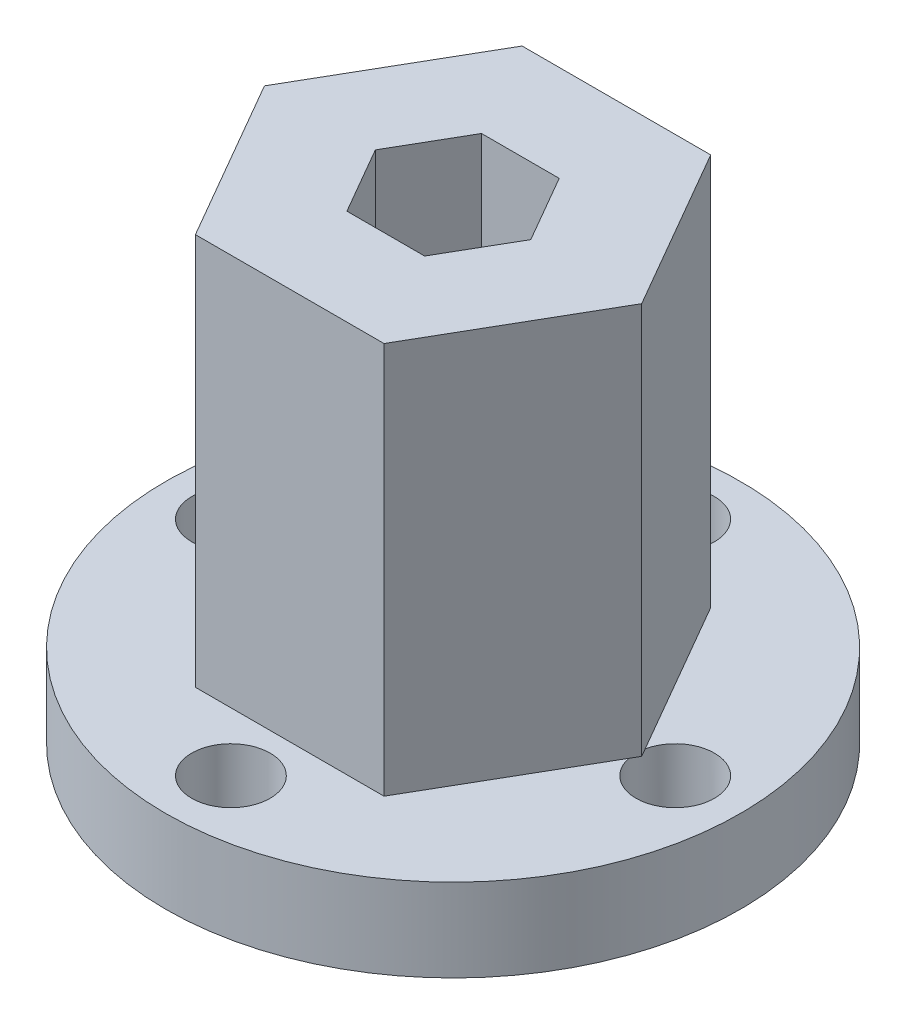
ISO-10303-21;
HEADER;
FILE_DESCRIPTION(('STEP AP214'),'2;1');
FILE_NAME('part.step','',(''),(''),'','','');
FILE_SCHEMA(('AUTOMOTIVE_DESIGN { 1 0 10303 214 1 1 1 1 }'));
ENDSEC;
DATA;
#1=APPLICATION_CONTEXT('core data for automotive mechanical design processes');
#2=APPLICATION_PROTOCOL_DEFINITION('international standard','automotive_design',2000,#1);
#3=PRODUCT_CONTEXT('',#1,'mechanical');
#4=PRODUCT('Part','Part','',(#3));
#5=PRODUCT_RELATED_PRODUCT_CATEGORY('part','',(#4));
#6=PRODUCT_DEFINITION_FORMATION('','',#4);
#7=PRODUCT_DEFINITION_CONTEXT('part definition',#1,'design');
#8=PRODUCT_DEFINITION('design','',#6,#7);
#9=PRODUCT_DEFINITION_SHAPE('','',#8);
#10=(LENGTH_UNIT() NAMED_UNIT(*) SI_UNIT(.MILLI.,.METRE.));
#11=(NAMED_UNIT(*) PLANE_ANGLE_UNIT() SI_UNIT($,.RADIAN.));
#12=(NAMED_UNIT(*) SI_UNIT($,.STERADIAN.) SOLID_ANGLE_UNIT());
#13=UNCERTAINTY_MEASURE_WITH_UNIT(LENGTH_MEASURE(1.E-05),#10,'distance_accuracy_value','');
#14=(GEOMETRIC_REPRESENTATION_CONTEXT(3) GLOBAL_UNCERTAINTY_ASSIGNED_CONTEXT((#13)) GLOBAL_UNIT_ASSIGNED_CONTEXT((#10,
#11,#12)) REPRESENTATION_CONTEXT('',''));
#15=CARTESIAN_POINT('',(0.,0.,0.));
#16=DIRECTION('',(0.,0.,1.));
#17=DIRECTION('',(1.,0.,0.));
#18=AXIS2_PLACEMENT_3D('',#15,#16,#17);
#19=CARTESIAN_POINT('',(0.,3.175,0.));
#20=DIRECTION('',(0.,-1.,0.));
#21=DIRECTION('',(0.,0.,-1.));
#22=AXIS2_PLACEMENT_3D('',#19,#20,#21);
#23=CYLINDRICAL_SURFACE('',#22,11.);
#24=CARTESIAN_POINT('',(0.,3.175,0.));
#25=DIRECTION('',(0.,1.,0.));
#26=DIRECTION('',(0.,0.,1.));
#27=AXIS2_PLACEMENT_3D('',#24,#25,#26);
#28=CIRCLE('',#27,11.);
#29=CARTESIAN_POINT('',(0.,3.175,11.));
#30=VERTEX_POINT('',#29);
#31=EDGE_CURVE('E11',#30,#30,#28,.T.);
#32=ORIENTED_EDGE('',*,*,#31,.F.);
#33=EDGE_LOOP('',(#32));
#34=FACE_BOUND('',#33,.T.);
#35=CARTESIAN_POINT('',(0.,0.,0.));
#36=DIRECTION('',(0.,1.,0.));
#37=DIRECTION('',(0.,0.,1.));
#38=AXIS2_PLACEMENT_3D('',#35,#36,#37);
#39=CIRCLE('',#38,11.);
#40=CARTESIAN_POINT('',(0.,0.,11.));
#41=VERTEX_POINT('',#40);
#42=EDGE_CURVE('E47',#41,#41,#39,.T.);
#43=ORIENTED_EDGE('',*,*,#42,.T.);
#44=EDGE_LOOP('',(#43));
#45=FACE_BOUND('',#44,.T.);
#46=ADVANCED_FACE('F38',(#34,#45),#23,.T.);
#47=CARTESIAN_POINT('',(0.,3.175,0.));
#48=DIRECTION('',(0.,1.,0.));
#49=DIRECTION('',(0.,0.,1.));
#50=AXIS2_PLACEMENT_3D('',#47,#48,#49);
#51=PLANE('',#50);
#52=CARTESIAN_POINT('',(0.,3.175,-8.5));
#53=DIRECTION('',(0.,1.,0.));
#54=DIRECTION('',(0.,0.,1.));
#55=AXIS2_PLACEMENT_3D('',#52,#53,#54);
#56=CIRCLE('',#55,1.5);
#57=CARTESIAN_POINT('',(0.,3.175,-7.));
#58=VERTEX_POINT('',#57);
#59=EDGE_CURVE('E351',#58,#58,#56,.T.);
#60=ORIENTED_EDGE('',*,*,#59,.F.);
#61=EDGE_LOOP('',(#60));
#62=FACE_BOUND('',#61,.T.);
#63=CARTESIAN_POINT('',(8.50000000000024,3.175,-2.40543580379159E-13));
#64=DIRECTION('',(0.,1.,0.));
#65=DIRECTION('',(0.,0.,1.));
#66=AXIS2_PLACEMENT_3D('',#63,#64,#65);
#67=CIRCLE('',#66,1.50000000000019);
#68=CARTESIAN_POINT('',(7.03387331532343,3.175,0.316974043856885));
#69=VERTEX_POINT('',#68);
#70=CARTESIAN_POINT('',(7.03387331532335,3.175,-0.316974043857019));
#71=VERTEX_POINT('',#70);
#72=EDGE_CURVE('E347',#69,#71,#67,.T.);
#73=ORIENTED_EDGE('',*,*,#72,.F.);
#74=DIRECTION('',(0.5,0.,-0.866025403784439));
#75=VECTOR('',#74,1.);
#76=CARTESIAN_POINT('',(3.60843918243516,3.175,6.25));
#77=LINE('',#76,#75);
#78=CARTESIAN_POINT('',(3.60843918243516,3.175,6.25));
#79=VERTEX_POINT('',#78);
#80=EDGE_CURVE('E179',#79,#69,#77,.T.);
#81=ORIENTED_EDGE('',*,*,#80,.F.);
#82=DIRECTION('',(1.,0.,0.));
#83=VECTOR('',#82,1.);
#84=CARTESIAN_POINT('',(-3.60843918243517,3.175,6.25));
#85=LINE('',#84,#83);
#86=CARTESIAN_POINT('',(-3.60843918243517,3.175,6.25));
#87=VERTEX_POINT('',#86);
#88=EDGE_CURVE('E165',#87,#79,#85,.T.);
#89=ORIENTED_EDGE('',*,*,#88,.F.);
#90=DIRECTION('',(0.5,0.,0.866025403784439));
#91=VECTOR('',#90,1.);
#92=CARTESIAN_POINT('',(-7.21687836487033,3.175,0.));
#93=LINE('',#92,#91);
#94=CARTESIAN_POINT('',(-7.03387331532285,3.175,0.316974043857877));
#95=VERTEX_POINT('',#94);
#96=EDGE_CURVE('E160',#95,#87,#93,.T.);
#97=ORIENTED_EDGE('',*,*,#96,.F.);
#98=CARTESIAN_POINT('',(-8.49999999999976,3.175,2.41584530158434E-13));
#99=DIRECTION('',(0.,1.,0.));
#100=DIRECTION('',(0.,0.,1.));
#101=AXIS2_PLACEMENT_3D('',#98,#99,#100);
#102=CIRCLE('',#101,1.50000000000039);
#103=CARTESIAN_POINT('',(-7.03387331532293,3.175,-0.316974043857749));
#104=VERTEX_POINT('',#103);
#105=EDGE_CURVE('E141',#104,#95,#102,.T.);
#106=ORIENTED_EDGE('',*,*,#105,.F.);
#107=DIRECTION('',(-0.5,0.,0.866025403784439));
#108=VECTOR('',#107,1.);
#109=CARTESIAN_POINT('',(-3.60843918243516,3.175,-6.25));
#110=LINE('',#109,#108);
#111=CARTESIAN_POINT('',(-3.60843918243516,3.175,-6.25));
#112=VERTEX_POINT('',#111);
#113=EDGE_CURVE('E197',#112,#104,#110,.T.);
#114=ORIENTED_EDGE('',*,*,#113,.F.);
#115=DIRECTION('',(-1.,0.,0.));
#116=VECTOR('',#115,1.);
#117=CARTESIAN_POINT('',(3.60843918243517,3.175,-6.25));
#118=LINE('',#117,#116);
#119=CARTESIAN_POINT('',(3.60843918243517,3.175,-6.25));
#120=VERTEX_POINT('',#119);
#121=EDGE_CURVE('E193',#120,#112,#118,.T.);
#122=ORIENTED_EDGE('',*,*,#121,.F.);
#123=DIRECTION('',(-0.5,0.,-0.866025403784439));
#124=VECTOR('',#123,1.);
#125=CARTESIAN_POINT('',(7.21687836487033,3.175,0.));
#126=LINE('',#125,#124);
#127=EDGE_CURVE('E188',#71,#120,#126,.T.);
#128=ORIENTED_EDGE('',*,*,#127,.F.);
#129=EDGE_LOOP('',(#73,#81,#89,#97,#106,#114,#122,#128));
#130=FACE_BOUND('',#129,.T.);
#131=CARTESIAN_POINT('',(4.81087160758318E-13,3.175,8.5));
#132=DIRECTION('',(0.,1.,0.));
#133=DIRECTION('',(0.,0.,1.));
#134=AXIS2_PLACEMENT_3D('',#131,#132,#133);
#135=CIRCLE('',#134,1.50000000000052);
#136=CARTESIAN_POINT('',(4.81087160758318E-13,3.175,10.0000000000005));
#137=VERTEX_POINT('',#136);
#138=EDGE_CURVE('E158',#137,#137,#135,.T.);
#139=ORIENTED_EDGE('',*,*,#138,.F.);
#140=EDGE_LOOP('',(#139));
#141=FACE_BOUND('',#140,.T.);
#142=ORIENTED_EDGE('',*,*,#31,.T.);
#143=EDGE_LOOP('',(#142));
#144=FACE_BOUND('',#143,.T.);
#145=ADVANCED_FACE('F162',(#62,#130,#141,#144),#51,.T.);
#146=CARTESIAN_POINT('',(0.,0.,0.));
#147=DIRECTION('',(0.,1.,0.));
#148=DIRECTION('',(0.,0.,1.));
#149=AXIS2_PLACEMENT_3D('',#146,#147,#148);
#150=PLANE('',#149);
#151=CARTESIAN_POINT('',(0.,0.,-8.5));
#152=DIRECTION('',(0.,1.,0.));
#153=DIRECTION('',(0.,0.,1.));
#154=AXIS2_PLACEMENT_3D('',#151,#152,#153);
#155=CIRCLE('',#154,1.5);
#156=CARTESIAN_POINT('',(0.,0.,-7.));
#157=VERTEX_POINT('',#156);
#158=EDGE_CURVE('E41',#157,#157,#155,.T.);
#159=ORIENTED_EDGE('',*,*,#158,.T.);
#160=EDGE_LOOP('',(#159));
#161=FACE_BOUND('',#160,.T.);
#162=CARTESIAN_POINT('',(8.50000000000024,0.,-2.40543580379159E-13));
#163=DIRECTION('',(0.,1.,0.));
#164=DIRECTION('',(0.,0.,1.));
#165=AXIS2_PLACEMENT_3D('',#162,#163,#164);
#166=CIRCLE('',#165,1.50000000000019);
#167=CARTESIAN_POINT('',(8.50000000000024,0.,1.49999999999995));
#168=VERTEX_POINT('',#167);
#169=EDGE_CURVE('E233',#168,#168,#166,.T.);
#170=ORIENTED_EDGE('',*,*,#169,.T.);
#171=EDGE_LOOP('',(#170));
#172=FACE_BOUND('',#171,.T.);
#173=CARTESIAN_POINT('',(4.81087160758318E-13,0.,8.5));
#174=DIRECTION('',(0.,1.,0.));
#175=DIRECTION('',(0.,0.,1.));
#176=AXIS2_PLACEMENT_3D('',#173,#174,#175);
#177=CIRCLE('',#176,1.50000000000052);
#178=CARTESIAN_POINT('',(4.81087160758318E-13,0.,10.0000000000005));
#179=VERTEX_POINT('',#178);
#180=EDGE_CURVE('E229',#179,#179,#177,.T.);
#181=ORIENTED_EDGE('',*,*,#180,.T.);
#182=EDGE_LOOP('',(#181));
#183=FACE_BOUND('',#182,.T.);
#184=CARTESIAN_POINT('',(-8.49999999999976,0.,2.41584530158434E-13));
#185=DIRECTION('',(0.,1.,0.));
#186=DIRECTION('',(0.,0.,1.));
#187=AXIS2_PLACEMENT_3D('',#184,#185,#186);
#188=CIRCLE('',#187,1.50000000000039);
#189=CARTESIAN_POINT('',(-8.49999999999976,0.,1.50000000000063));
#190=VERTEX_POINT('',#189);
#191=EDGE_CURVE('E225',#190,#190,#188,.T.);
#192=ORIENTED_EDGE('',*,*,#191,.T.);
#193=EDGE_LOOP('',(#192));
#194=FACE_BOUND('',#193,.T.);
#195=DIRECTION('',(0.5,0.,0.866025403784439));
#196=VECTOR('',#195,1.);
#197=CARTESIAN_POINT('',(-2.23001541474493,0.,1.2875));
#198=LINE('',#197,#196);
#199=CARTESIAN_POINT('',(-2.97335388632657,0.,0.));
#200=VERTEX_POINT('',#199);
#201=CARTESIAN_POINT('',(-1.48667694316329,0.,2.575));
#202=VERTEX_POINT('',#201);
#203=EDGE_CURVE('E303',#200,#202,#198,.T.);
#204=ORIENTED_EDGE('',*,*,#203,.T.);
#205=DIRECTION('',(1.,0.,0.));
#206=VECTOR('',#205,1.);
#207=CARTESIAN_POINT('',(0.,0.,2.575));
#208=LINE('',#207,#206);
#209=CARTESIAN_POINT('',(1.48667694316329,0.,2.575));
#210=VERTEX_POINT('',#209);
#211=EDGE_CURVE('E170',#202,#210,#208,.T.);
#212=ORIENTED_EDGE('',*,*,#211,.T.);
#213=DIRECTION('',(0.5,0.,-0.866025403784439));
#214=VECTOR('',#213,1.);
#215=CARTESIAN_POINT('',(2.23001541474493,0.,1.2875));
#216=LINE('',#215,#214);
#217=CARTESIAN_POINT('',(2.97335388632657,0.,0.));
#218=VERTEX_POINT('',#217);
#219=EDGE_CURVE('E274',#210,#218,#216,.T.);
#220=ORIENTED_EDGE('',*,*,#219,.T.);
#221=DIRECTION('',(-0.5,0.,-0.866025403784438));
#222=VECTOR('',#221,1.);
#223=CARTESIAN_POINT('',(2.23001541474493,0.,-1.2875));
#224=LINE('',#223,#222);
#225=CARTESIAN_POINT('',(1.48667694316329,0.,-2.575));
#226=VERTEX_POINT('',#225);
#227=EDGE_CURVE('E291',#218,#226,#224,.T.);
#228=ORIENTED_EDGE('',*,*,#227,.T.);
#229=DIRECTION('',(-1.,0.,0.));
#230=VECTOR('',#229,1.);
#231=CARTESIAN_POINT('',(0.,0.,-2.575));
#232=LINE('',#231,#230);
#233=CARTESIAN_POINT('',(-1.48667694316329,0.,-2.575));
#234=VERTEX_POINT('',#233);
#235=EDGE_CURVE('E295',#226,#234,#232,.T.);
#236=ORIENTED_EDGE('',*,*,#235,.T.);
#237=DIRECTION('',(-0.5,0.,0.866025403784439));
#238=VECTOR('',#237,1.);
#239=CARTESIAN_POINT('',(-2.23001541474493,0.,-1.2875));
#240=LINE('',#239,#238);
#241=EDGE_CURVE('E299',#234,#200,#240,.T.);
#242=ORIENTED_EDGE('',*,*,#241,.T.);
#243=EDGE_LOOP('',(#204,#212,#220,#228,#236,#242));
#244=FACE_BOUND('',#243,.T.);
#245=ORIENTED_EDGE('',*,*,#42,.F.);
#246=EDGE_LOOP('',(#245));
#247=FACE_BOUND('',#246,.T.);
#248=ADVANCED_FACE('F370',(#161,#172,#183,#194,#244,#247),#150,.F.);
#249=CARTESIAN_POINT('',(-7.21687836487033,18.175,0.));
#250=DIRECTION('',(0.866025403784439,0.,-0.5));
#251=DIRECTION('',(-0.5,0.,-0.866025403784439));
#252=AXIS2_PLACEMENT_3D('',#249,#250,#251);
#253=PLANE('',#252);
#254=CARTESIAN_POINT('',(-7.21687836487033,3.175,0.));
#255=VERTEX_POINT('',#254);
#256=EDGE_CURVE('E154',#255,#95,#93,.T.);
#257=ORIENTED_EDGE('',*,*,#256,.T.);
#258=ORIENTED_EDGE('',*,*,#96,.T.);
#259=DIRECTION('',(0.,-1.,0.));
#260=VECTOR('',#259,1.);
#261=CARTESIAN_POINT('',(-3.60843918243517,18.175,6.25));
#262=LINE('',#261,#260);
#263=CARTESIAN_POINT('',(-3.60843918243517,18.175,6.25));
#264=VERTEX_POINT('',#263);
#265=EDGE_CURVE('E219',#264,#87,#262,.T.);
#266=ORIENTED_EDGE('',*,*,#265,.F.);
#267=DIRECTION('',(0.5,0.,0.866025403784439));
#268=VECTOR('',#267,1.);
#269=CARTESIAN_POINT('',(-7.21687836487033,18.175,0.));
#270=LINE('',#269,#268);
#271=CARTESIAN_POINT('',(-7.21687836487033,18.175,0.));
#272=VERTEX_POINT('',#271);
#273=EDGE_CURVE('E200',#272,#264,#270,.T.);
#274=ORIENTED_EDGE('',*,*,#273,.F.);
#275=DIRECTION('',(0.,-1.,0.));
#276=VECTOR('',#275,1.);
#277=CARTESIAN_POINT('',(-7.21687836487033,18.175,0.));
#278=LINE('',#277,#276);
#279=EDGE_CURVE('E176',#272,#255,#278,.T.);
#280=ORIENTED_EDGE('',*,*,#279,.T.);
#281=EDGE_LOOP('',(#257,#258,#266,#274,#280));
#282=FACE_BOUND('',#281,.T.);
#283=ADVANCED_FACE('F173',(#282),#253,.F.);
#284=CARTESIAN_POINT('',(-3.60843918243517,18.175,6.25));
#285=DIRECTION('',(0.,0.,-1.));
#286=DIRECTION('',(-1.,0.,0.));
#287=AXIS2_PLACEMENT_3D('',#284,#285,#286);
#288=PLANE('',#287);
#289=ORIENTED_EDGE('',*,*,#88,.T.);
#290=DIRECTION('',(0.,-1.,0.));
#291=VECTOR('',#290,1.);
#292=CARTESIAN_POINT('',(3.60843918243516,18.175,6.25));
#293=LINE('',#292,#291);
#294=CARTESIAN_POINT('',(3.60843918243516,18.175,6.25));
#295=VERTEX_POINT('',#294);
#296=EDGE_CURVE('E215',#295,#79,#293,.T.);
#297=ORIENTED_EDGE('',*,*,#296,.F.);
#298=DIRECTION('',(1.,0.,0.));
#299=VECTOR('',#298,1.);
#300=CARTESIAN_POINT('',(-3.60843918243517,18.175,6.25));
#301=LINE('',#300,#299);
#302=EDGE_CURVE('E313',#264,#295,#301,.T.);
#303=ORIENTED_EDGE('',*,*,#302,.F.);
#304=ORIENTED_EDGE('',*,*,#265,.T.);
#305=EDGE_LOOP('',(#289,#297,#303,#304));
#306=FACE_BOUND('',#305,.T.);
#307=ADVANCED_FACE('F332',(#306),#288,.F.);
#308=CARTESIAN_POINT('',(3.60843918243516,18.175,6.25));
#309=DIRECTION('',(-0.866025403784439,0.,-0.5));
#310=DIRECTION('',(-0.5,0.,0.866025403784439));
#311=AXIS2_PLACEMENT_3D('',#308,#309,#310);
#312=PLANE('',#311);
#313=ORIENTED_EDGE('',*,*,#80,.T.);
#314=DIRECTION('',(0.5,0.,-0.866025403784439));
#315=VECTOR('',#314,1.);
#316=CARTESIAN_POINT('',(3.60843918243516,3.175,6.25));
#317=LINE('',#316,#315);
#318=CARTESIAN_POINT('',(7.21687836487033,3.175,0.));
#319=VERTEX_POINT('',#318);
#320=EDGE_CURVE('E230',#69,#319,#317,.T.);
#321=ORIENTED_EDGE('',*,*,#320,.T.);
#322=DIRECTION('',(0.,-1.,0.));
#323=VECTOR('',#322,1.);
#324=CARTESIAN_POINT('',(7.21687836487033,18.175,0.));
#325=LINE('',#324,#323);
#326=CARTESIAN_POINT('',(7.21687836487033,18.175,0.));
#327=VERTEX_POINT('',#326);
#328=EDGE_CURVE('E211',#327,#319,#325,.T.);
#329=ORIENTED_EDGE('',*,*,#328,.F.);
#330=DIRECTION('',(0.5,0.,-0.866025403784439));
#331=VECTOR('',#330,1.);
#332=CARTESIAN_POINT('',(3.60843918243516,18.175,6.25));
#333=LINE('',#332,#331);
#334=EDGE_CURVE('E316',#295,#327,#333,.T.);
#335=ORIENTED_EDGE('',*,*,#334,.F.);
#336=ORIENTED_EDGE('',*,*,#296,.T.);
#337=EDGE_LOOP('',(#313,#321,#329,#335,#336));
#338=FACE_BOUND('',#337,.T.);
#339=ADVANCED_FACE('F340',(#338),#312,.F.);
#340=CARTESIAN_POINT('',(7.21687836487033,18.175,0.));
#341=DIRECTION('',(-0.866025403784439,0.,0.5));
#342=DIRECTION('',(0.5,0.,0.866025403784439));
#343=AXIS2_PLACEMENT_3D('',#340,#341,#342);
#344=PLANE('',#343);
#345=EDGE_CURVE('E189',#319,#71,#126,.T.);
#346=ORIENTED_EDGE('',*,*,#345,.T.);
#347=ORIENTED_EDGE('',*,*,#127,.T.);
#348=DIRECTION('',(0.,-1.,0.));
#349=VECTOR('',#348,1.);
#350=CARTESIAN_POINT('',(3.60843918243517,18.175,-6.25));
#351=LINE('',#350,#349);
#352=CARTESIAN_POINT('',(3.60843918243517,18.175,-6.25));
#353=VERTEX_POINT('',#352);
#354=EDGE_CURVE('E207',#353,#120,#351,.T.);
#355=ORIENTED_EDGE('',*,*,#354,.F.);
#356=DIRECTION('',(-0.5,0.,-0.866025403784439));
#357=VECTOR('',#356,1.);
#358=CARTESIAN_POINT('',(7.21687836487033,18.175,0.));
#359=LINE('',#358,#357);
#360=EDGE_CURVE('E319',#327,#353,#359,.T.);
#361=ORIENTED_EDGE('',*,*,#360,.F.);
#362=ORIENTED_EDGE('',*,*,#328,.T.);
#363=EDGE_LOOP('',(#346,#347,#355,#361,#362));
#364=FACE_BOUND('',#363,.T.);
#365=ADVANCED_FACE('F342',(#364),#344,.F.);
#366=CARTESIAN_POINT('',(3.60843918243517,18.175,-6.25));
#367=DIRECTION('',(0.,0.,1.));
#368=DIRECTION('',(1.,0.,0.));
#369=AXIS2_PLACEMENT_3D('',#366,#367,#368);
#370=PLANE('',#369);
#371=ORIENTED_EDGE('',*,*,#121,.T.);
#372=DIRECTION('',(0.,-1.,0.));
#373=VECTOR('',#372,1.);
#374=CARTESIAN_POINT('',(-3.60843918243516,18.175,-6.25));
#375=LINE('',#374,#373);
#376=CARTESIAN_POINT('',(-3.60843918243516,18.175,-6.25));
#377=VERTEX_POINT('',#376);
#378=EDGE_CURVE('E203',#377,#112,#375,.T.);
#379=ORIENTED_EDGE('',*,*,#378,.F.);
#380=DIRECTION('',(-1.,0.,0.));
#381=VECTOR('',#380,1.);
#382=CARTESIAN_POINT('',(3.60843918243517,18.175,-6.25));
#383=LINE('',#382,#381);
#384=EDGE_CURVE('E321',#353,#377,#383,.T.);
#385=ORIENTED_EDGE('',*,*,#384,.F.);
#386=ORIENTED_EDGE('',*,*,#354,.T.);
#387=EDGE_LOOP('',(#371,#379,#385,#386));
#388=FACE_BOUND('',#387,.T.);
#389=ADVANCED_FACE('F346',(#388),#370,.F.);
#390=CARTESIAN_POINT('',(-3.60843918243516,18.175,-6.25));
#391=DIRECTION('',(0.866025403784438,0.,0.5));
#392=DIRECTION('',(0.5,0.,-0.866025403784439));
#393=AXIS2_PLACEMENT_3D('',#390,#391,#392);
#394=PLANE('',#393);
#395=ORIENTED_EDGE('',*,*,#113,.T.);
#396=EDGE_CURVE('E156',#104,#255,#110,.T.);
#397=ORIENTED_EDGE('',*,*,#396,.T.);
#398=ORIENTED_EDGE('',*,*,#279,.F.);
#399=DIRECTION('',(-0.5,0.,0.866025403784439));
#400=VECTOR('',#399,1.);
#401=CARTESIAN_POINT('',(-3.60843918243516,18.175,-6.25));
#402=LINE('',#401,#400);
#403=EDGE_CURVE('E182',#377,#272,#402,.T.);
#404=ORIENTED_EDGE('',*,*,#403,.F.);
#405=ORIENTED_EDGE('',*,*,#378,.T.);
#406=EDGE_LOOP('',(#395,#397,#398,#404,#405));
#407=FACE_BOUND('',#406,.T.);
#408=ADVANCED_FACE('F330',(#407),#394,.F.);
#409=CARTESIAN_POINT('',(0.,18.175,0.));
#410=DIRECTION('',(0.,1.,0.));
#411=DIRECTION('',(0.,0.,1.));
#412=AXIS2_PLACEMENT_3D('',#409,#410,#411);
#413=PLANE('',#412);
#414=DIRECTION('',(1.,0.,0.));
#415=VECTOR('',#414,1.);
#416=CARTESIAN_POINT('',(-1.48667694316329,18.175,2.575));
#417=LINE('',#416,#415);
#418=CARTESIAN_POINT('',(-1.48667694316329,18.175,2.575));
#419=VERTEX_POINT('',#418);
#420=CARTESIAN_POINT('',(1.48667694316329,18.175,2.575));
#421=VERTEX_POINT('',#420);
#422=EDGE_CURVE('E240',#419,#421,#417,.T.);
#423=ORIENTED_EDGE('',*,*,#422,.F.);
#424=DIRECTION('',(0.5,0.,0.866025403784438));
#425=VECTOR('',#424,1.);
#426=CARTESIAN_POINT('',(-2.97335388632657,18.175,0.));
#427=LINE('',#426,#425);
#428=CARTESIAN_POINT('',(-2.97335388632657,18.175,0.));
#429=VERTEX_POINT('',#428);
#430=EDGE_CURVE('E266',#429,#419,#427,.T.);
#431=ORIENTED_EDGE('',*,*,#430,.F.);
#432=DIRECTION('',(-0.5,0.,0.866025403784439));
#433=VECTOR('',#432,1.);
#434=CARTESIAN_POINT('',(-1.48667694316329,18.175,-2.575));
#435=LINE('',#434,#433);
#436=CARTESIAN_POINT('',(-1.48667694316329,18.175,-2.575));
#437=VERTEX_POINT('',#436);
#438=EDGE_CURVE('E262',#437,#429,#435,.T.);
#439=ORIENTED_EDGE('',*,*,#438,.F.);
#440=DIRECTION('',(-1.,0.,0.));
#441=VECTOR('',#440,1.);
#442=CARTESIAN_POINT('',(1.48667694316329,18.175,-2.575));
#443=LINE('',#442,#441);
#444=CARTESIAN_POINT('',(1.48667694316329,18.175,-2.575));
#445=VERTEX_POINT('',#444);
#446=EDGE_CURVE('E258',#445,#437,#443,.T.);
#447=ORIENTED_EDGE('',*,*,#446,.F.);
#448=DIRECTION('',(-0.5,0.,-0.866025403784438));
#449=VECTOR('',#448,1.);
#450=CARTESIAN_POINT('',(2.97335388632657,18.175,0.));
#451=LINE('',#450,#449);
#452=CARTESIAN_POINT('',(2.97335388632657,18.175,0.));
#453=VERTEX_POINT('',#452);
#454=EDGE_CURVE('E251',#453,#445,#451,.T.);
#455=ORIENTED_EDGE('',*,*,#454,.F.);
#456=DIRECTION('',(0.5,0.,-0.866025403784438));
#457=VECTOR('',#456,1.);
#458=CARTESIAN_POINT('',(1.48667694316329,18.175,2.575));
#459=LINE('',#458,#457);
#460=EDGE_CURVE('E244',#421,#453,#459,.T.);
#461=ORIENTED_EDGE('',*,*,#460,.F.);
#462=EDGE_LOOP('',(#423,#431,#439,#447,#455,#461));
#463=FACE_BOUND('',#462,.T.);
#464=ORIENTED_EDGE('',*,*,#273,.T.);
#465=ORIENTED_EDGE('',*,*,#302,.T.);
#466=ORIENTED_EDGE('',*,*,#334,.T.);
#467=ORIENTED_EDGE('',*,*,#360,.T.);
#468=ORIENTED_EDGE('',*,*,#384,.T.);
#469=ORIENTED_EDGE('',*,*,#403,.T.);
#470=EDGE_LOOP('',(#464,#465,#466,#467,#468,#469));
#471=FACE_BOUND('',#470,.T.);
#472=ADVANCED_FACE('F328',(#463,#471),#413,.T.);
#473=CARTESIAN_POINT('',(-1.48667694316329,-9.825,2.575));
#474=DIRECTION('',(0.,0.,1.));
#475=DIRECTION('',(1.,0.,0.));
#476=AXIS2_PLACEMENT_3D('',#473,#474,#475);
#477=PLANE('',#476);
#478=DIRECTION('',(0.,1.,0.));
#479=VECTOR('',#478,1.);
#480=CARTESIAN_POINT('',(-1.48667694316329,-9.825,2.575));
#481=LINE('',#480,#479);
#482=EDGE_CURVE('E271',#202,#419,#481,.T.);
#483=ORIENTED_EDGE('',*,*,#482,.T.);
#484=ORIENTED_EDGE('',*,*,#422,.T.);
#485=DIRECTION('',(0.,1.,0.));
#486=VECTOR('',#485,1.);
#487=CARTESIAN_POINT('',(1.48667694316329,-9.825,2.575));
#488=LINE('',#487,#486);
#489=EDGE_CURVE('E270',#210,#421,#488,.T.);
#490=ORIENTED_EDGE('',*,*,#489,.F.);
#491=ORIENTED_EDGE('',*,*,#211,.F.);
#492=EDGE_LOOP('',(#483,#484,#490,#491));
#493=FACE_BOUND('',#492,.T.);
#494=ADVANCED_FACE('F397',(#493),#477,.F.);
#495=CARTESIAN_POINT('',(-2.97335388632657,-9.825,0.));
#496=DIRECTION('',(-0.866025403784439,0.,0.5));
#497=DIRECTION('',(0.5,0.,0.866025403784439));
#498=AXIS2_PLACEMENT_3D('',#495,#496,#497);
#499=PLANE('',#498);
#500=DIRECTION('',(0.,1.,0.));
#501=VECTOR('',#500,1.);
#502=CARTESIAN_POINT('',(-2.97335388632657,-9.825,0.));
#503=LINE('',#502,#501);
#504=EDGE_CURVE('E275',#200,#429,#503,.T.);
#505=ORIENTED_EDGE('',*,*,#504,.T.);
#506=ORIENTED_EDGE('',*,*,#430,.T.);
#507=ORIENTED_EDGE('',*,*,#482,.F.);
#508=ORIENTED_EDGE('',*,*,#203,.F.);
#509=EDGE_LOOP('',(#505,#506,#507,#508));
#510=FACE_BOUND('',#509,.T.);
#511=ADVANCED_FACE('F401',(#510),#499,.F.);
#512=CARTESIAN_POINT('',(-1.48667694316329,-9.825,-2.575));
#513=DIRECTION('',(-0.866025403784439,0.,-0.5));
#514=DIRECTION('',(-0.5,0.,0.866025403784439));
#515=AXIS2_PLACEMENT_3D('',#512,#513,#514);
#516=PLANE('',#515);
#517=DIRECTION('',(0.,1.,0.));
#518=VECTOR('',#517,1.);
#519=CARTESIAN_POINT('',(-1.48667694316329,-9.825,-2.575));
#520=LINE('',#519,#518);
#521=EDGE_CURVE('E278',#234,#437,#520,.T.);
#522=ORIENTED_EDGE('',*,*,#521,.T.);
#523=ORIENTED_EDGE('',*,*,#438,.T.);
#524=ORIENTED_EDGE('',*,*,#504,.F.);
#525=ORIENTED_EDGE('',*,*,#241,.F.);
#526=EDGE_LOOP('',(#522,#523,#524,#525));
#527=FACE_BOUND('',#526,.T.);
#528=ADVANCED_FACE('F412',(#527),#516,.F.);
#529=CARTESIAN_POINT('',(1.48667694316329,-9.825,-2.575));
#530=DIRECTION('',(0.,0.,-1.));
#531=DIRECTION('',(-1.,0.,0.));
#532=AXIS2_PLACEMENT_3D('',#529,#530,#531);
#533=PLANE('',#532);
#534=DIRECTION('',(0.,1.,0.));
#535=VECTOR('',#534,1.);
#536=CARTESIAN_POINT('',(1.48667694316329,-9.825,-2.575));
#537=LINE('',#536,#535);
#538=EDGE_CURVE('E281',#226,#445,#537,.T.);
#539=ORIENTED_EDGE('',*,*,#538,.T.);
#540=ORIENTED_EDGE('',*,*,#446,.T.);
#541=ORIENTED_EDGE('',*,*,#521,.F.);
#542=ORIENTED_EDGE('',*,*,#235,.F.);
#543=EDGE_LOOP('',(#539,#540,#541,#542));
#544=FACE_BOUND('',#543,.T.);
#545=ADVANCED_FACE('F408',(#544),#533,.F.);
#546=CARTESIAN_POINT('',(2.97335388632657,-9.825,0.));
#547=DIRECTION('',(0.866025403784438,0.,-0.5));
#548=DIRECTION('',(-0.5,0.,-0.866025403784438));
#549=AXIS2_PLACEMENT_3D('',#546,#547,#548);
#550=PLANE('',#549);
#551=DIRECTION('',(0.,1.,0.));
#552=VECTOR('',#551,1.);
#553=CARTESIAN_POINT('',(2.97335388632657,-9.825,0.));
#554=LINE('',#553,#552);
#555=EDGE_CURVE('E63',#218,#453,#554,.T.);
#556=ORIENTED_EDGE('',*,*,#555,.T.);
#557=ORIENTED_EDGE('',*,*,#454,.T.);
#558=ORIENTED_EDGE('',*,*,#538,.F.);
#559=ORIENTED_EDGE('',*,*,#227,.F.);
#560=EDGE_LOOP('',(#556,#557,#558,#559));
#561=FACE_BOUND('',#560,.T.);
#562=ADVANCED_FACE('F405',(#561),#550,.F.);
#563=CARTESIAN_POINT('',(1.48667694316329,-9.825,2.575));
#564=DIRECTION('',(0.866025403784438,0.,0.5));
#565=DIRECTION('',(0.5,0.,-0.866025403784439));
#566=AXIS2_PLACEMENT_3D('',#563,#564,#565);
#567=PLANE('',#566);
#568=ORIENTED_EDGE('',*,*,#489,.T.);
#569=ORIENTED_EDGE('',*,*,#460,.T.);
#570=ORIENTED_EDGE('',*,*,#555,.F.);
#571=ORIENTED_EDGE('',*,*,#219,.F.);
#572=EDGE_LOOP('',(#568,#569,#570,#571));
#573=FACE_BOUND('',#572,.T.);
#574=ADVANCED_FACE('F402',(#573),#567,.F.);
#575=CARTESIAN_POINT('',(-8.49999999999976,-4.825,2.41584530158434E-13));
#576=DIRECTION('',(0.,1.,0.));
#577=DIRECTION('',(0.,0.,1.));
#578=AXIS2_PLACEMENT_3D('',#575,#576,#577);
#579=CYLINDRICAL_SURFACE('',#578,1.50000000000039);
#580=EDGE_CURVE('E145',#95,#104,#102,.T.);
#581=ORIENTED_EDGE('',*,*,#580,.T.);
#582=ORIENTED_EDGE('',*,*,#105,.T.);
#583=EDGE_LOOP('',(#581,#582));
#584=FACE_BOUND('',#583,.T.);
#585=ORIENTED_EDGE('',*,*,#191,.F.);
#586=EDGE_LOOP('',(#585));
#587=FACE_BOUND('',#586,.T.);
#588=ADVANCED_FACE('F143',(#584,#587),#579,.F.);
#589=CARTESIAN_POINT('',(-8.49999999999976,3.175,2.41584530158434E-13));
#590=DIRECTION('',(0.,1.,0.));
#591=DIRECTION('',(0.,0.,1.));
#592=AXIS2_PLACEMENT_3D('',#589,#590,#591);
#593=PLANE('',#592);
#594=ORIENTED_EDGE('',*,*,#396,.F.);
#595=ORIENTED_EDGE('',*,*,#580,.F.);
#596=ORIENTED_EDGE('',*,*,#256,.F.);
#597=EDGE_LOOP('',(#594,#595,#596));
#598=FACE_BOUND('',#597,.T.);
#599=ADVANCED_FACE('F152',(#598),#593,.F.);
#600=CARTESIAN_POINT('',(8.50000000000024,-4.825,-2.40543580379159E-13));
#601=DIRECTION('',(0.,1.,0.));
#602=DIRECTION('',(0.,0.,1.));
#603=AXIS2_PLACEMENT_3D('',#600,#601,#602);
#604=CYLINDRICAL_SURFACE('',#603,1.50000000000019);
#605=EDGE_CURVE('E55',#71,#69,#67,.T.);
#606=ORIENTED_EDGE('',*,*,#605,.T.);
#607=ORIENTED_EDGE('',*,*,#72,.T.);
#608=EDGE_LOOP('',(#606,#607));
#609=FACE_BOUND('',#608,.T.);
#610=ORIENTED_EDGE('',*,*,#169,.F.);
#611=EDGE_LOOP('',(#610));
#612=FACE_BOUND('',#611,.T.);
#613=ADVANCED_FACE('F353',(#609,#612),#604,.F.);
#614=CARTESIAN_POINT('',(8.50000000000024,3.175,-2.40543580379159E-13));
#615=DIRECTION('',(0.,1.,0.));
#616=DIRECTION('',(0.,0.,1.));
#617=AXIS2_PLACEMENT_3D('',#614,#615,#616);
#618=PLANE('',#617);
#619=ORIENTED_EDGE('',*,*,#605,.F.);
#620=ORIENTED_EDGE('',*,*,#345,.F.);
#621=ORIENTED_EDGE('',*,*,#320,.F.);
#622=EDGE_LOOP('',(#619,#620,#621));
#623=FACE_BOUND('',#622,.T.);
#624=ADVANCED_FACE('F349',(#623),#618,.F.);
#625=CARTESIAN_POINT('',(4.81087160758318E-13,-4.825,8.5));
#626=DIRECTION('',(0.,1.,0.));
#627=DIRECTION('',(0.,0.,1.));
#628=AXIS2_PLACEMENT_3D('',#625,#626,#627);
#629=CYLINDRICAL_SURFACE('',#628,1.50000000000052);
#630=ORIENTED_EDGE('',*,*,#138,.T.);
#631=EDGE_LOOP('',(#630));
#632=FACE_BOUND('',#631,.T.);
#633=ORIENTED_EDGE('',*,*,#180,.F.);
#634=EDGE_LOOP('',(#633));
#635=FACE_BOUND('',#634,.T.);
#636=ADVANCED_FACE('F366',(#632,#635),#629,.F.);
#637=CARTESIAN_POINT('',(0.,-4.825,-8.5));
#638=DIRECTION('',(0.,1.,0.));
#639=DIRECTION('',(0.,0.,1.));
#640=AXIS2_PLACEMENT_3D('',#637,#638,#639);
#641=CYLINDRICAL_SURFACE('',#640,1.5);
#642=ORIENTED_EDGE('',*,*,#59,.T.);
#643=EDGE_LOOP('',(#642));
#644=FACE_BOUND('',#643,.T.);
#645=ORIENTED_EDGE('',*,*,#158,.F.);
#646=EDGE_LOOP('',(#645));
#647=FACE_BOUND('',#646,.T.);
#648=ADVANCED_FACE('F426',(#644,#647),#641,.F.);
#649=CLOSED_SHELL('',(#46,#145,#248,#283,#307,#339,#365,#389,#408,#472,#494,#511,#528,#545,#562,
#574,#588,#599,#613,#624,#636,#648));
#650=MANIFOLD_SOLID_BREP('B2',#649);
#651=ADVANCED_BREP_SHAPE_REPRESENTATION('',(#18,#650),#14);
#652=SHAPE_DEFINITION_REPRESENTATION(#9,#651);
ENDSEC;
END-ISO-10303-21;
